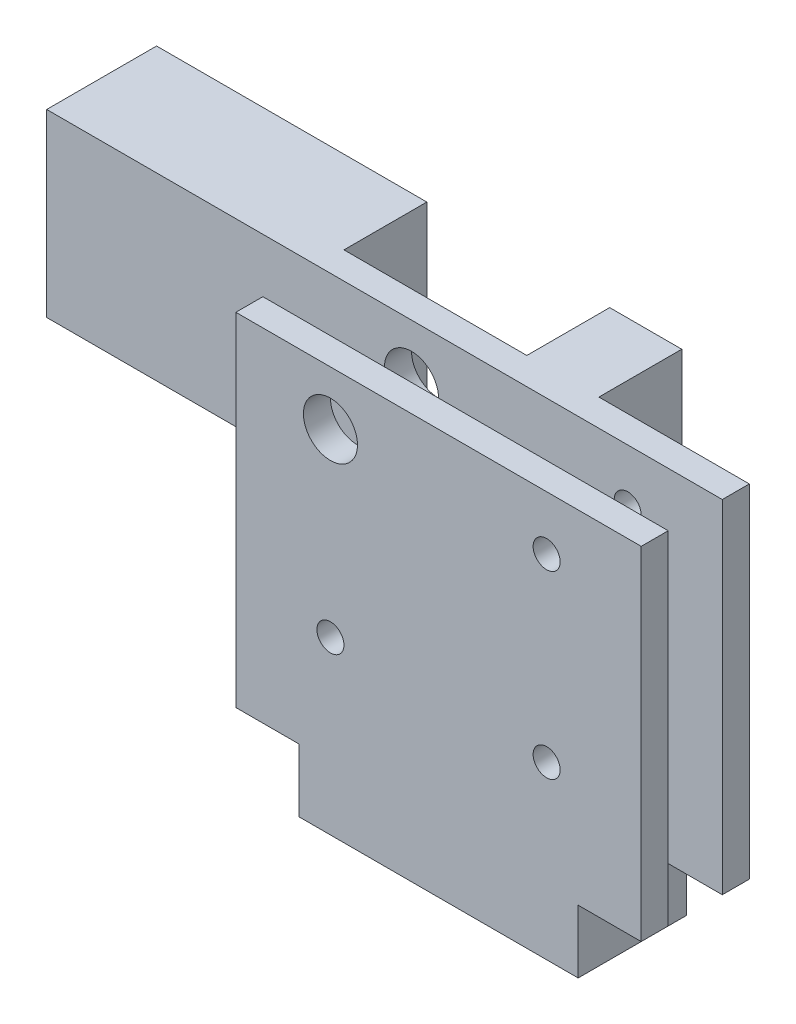
ISO-10303-21;
HEADER;
FILE_DESCRIPTION(('STEP AP214'),'2;1');
FILE_NAME('part.step','',(''),(''),'','','');
FILE_SCHEMA(('AUTOMOTIVE_DESIGN { 1 0 10303 214 1 1 1 1 }'));
ENDSEC;
DATA;
#1=APPLICATION_CONTEXT('core data for automotive mechanical design processes');
#2=APPLICATION_PROTOCOL_DEFINITION('international standard','automotive_design',2000,#1);
#3=PRODUCT_CONTEXT('',#1,'mechanical');
#4=PRODUCT('Part','Part','',(#3));
#5=PRODUCT_RELATED_PRODUCT_CATEGORY('part','',(#4));
#6=PRODUCT_DEFINITION_FORMATION('','',#4);
#7=PRODUCT_DEFINITION_CONTEXT('part definition',#1,'design');
#8=PRODUCT_DEFINITION('design','',#6,#7);
#9=PRODUCT_DEFINITION_SHAPE('','',#8);
#10=(LENGTH_UNIT() NAMED_UNIT(*) SI_UNIT(.MILLI.,.METRE.));
#11=(NAMED_UNIT(*) PLANE_ANGLE_UNIT() SI_UNIT($,.RADIAN.));
#12=(NAMED_UNIT(*) SI_UNIT($,.STERADIAN.) SOLID_ANGLE_UNIT());
#13=UNCERTAINTY_MEASURE_WITH_UNIT(LENGTH_MEASURE(1.E-05),#10,'distance_accuracy_value','');
#14=(GEOMETRIC_REPRESENTATION_CONTEXT(3) GLOBAL_UNCERTAINTY_ASSIGNED_CONTEXT((#13)) GLOBAL_UNIT_ASSIGNED_CONTEXT((#10,
#11,#12)) REPRESENTATION_CONTEXT('',''));
#15=CARTESIAN_POINT('',(0.,0.,0.));
#16=DIRECTION('',(0.,0.,1.));
#17=DIRECTION('',(1.,0.,0.));
#18=AXIS2_PLACEMENT_3D('',#15,#16,#17);
#19=CARTESIAN_POINT('',(0.,0.,0.));
#20=DIRECTION('',(0.,0.,1.));
#21=DIRECTION('',(1.,0.,0.));
#22=AXIS2_PLACEMENT_3D('',#19,#20,#21);
#23=PLANE('',#22);
#24=CARTESIAN_POINT('',(-12.,-3.5,0.));
#25=DIRECTION('',(0.,0.,1.));
#26=DIRECTION('',(1.,0.,0.));
#27=AXIS2_PLACEMENT_3D('',#24,#25,#26);
#28=CIRCLE('',#27,1.5);
#29=CARTESIAN_POINT('',(-10.5,-3.5,0.));
#30=VERTEX_POINT('',#29);
#31=EDGE_CURVE('E293',#30,#30,#28,.T.);
#32=ORIENTED_EDGE('',*,*,#31,.T.);
#33=EDGE_LOOP('',(#32));
#34=FACE_BOUND('',#33,.T.);
#35=CARTESIAN_POINT('',(12.,-3.49999999999999,0.));
#36=DIRECTION('',(0.,0.,1.));
#37=DIRECTION('',(1.,0.,0.));
#38=AXIS2_PLACEMENT_3D('',#35,#36,#37);
#39=CIRCLE('',#38,1.5);
#40=CARTESIAN_POINT('',(13.5,-3.49999999999999,0.));
#41=VERTEX_POINT('',#40);
#42=EDGE_CURVE('E274',#41,#41,#39,.T.);
#43=ORIENTED_EDGE('',*,*,#42,.T.);
#44=EDGE_LOOP('',(#43));
#45=FACE_BOUND('',#44,.T.);
#46=CARTESIAN_POINT('',(-12.,16.5,0.));
#47=DIRECTION('',(0.,0.,1.));
#48=DIRECTION('',(1.,0.,0.));
#49=AXIS2_PLACEMENT_3D('',#46,#47,#48);
#50=CIRCLE('',#49,3.);
#51=CARTESIAN_POINT('',(-9.,16.5,0.));
#52=VERTEX_POINT('',#51);
#53=EDGE_CURVE('E313',#52,#52,#50,.T.);
#54=ORIENTED_EDGE('',*,*,#53,.T.);
#55=EDGE_LOOP('',(#54));
#56=FACE_BOUND('',#55,.T.);
#57=CARTESIAN_POINT('',(12.,16.5,0.));
#58=DIRECTION('',(0.,0.,1.));
#59=DIRECTION('',(1.,0.,0.));
#60=AXIS2_PLACEMENT_3D('',#57,#58,#59);
#61=CIRCLE('',#60,1.5);
#62=CARTESIAN_POINT('',(13.5,16.5,0.));
#63=VERTEX_POINT('',#62);
#64=EDGE_CURVE('E312',#63,#63,#61,.T.);
#65=ORIENTED_EDGE('',*,*,#64,.T.);
#66=EDGE_LOOP('',(#65));
#67=FACE_BOUND('',#66,.T.);
#68=DIRECTION('',(0.,-1.,0.));
#69=VECTOR('',#68,1.);
#70=CARTESIAN_POINT('',(-22.5,22.5,0.));
#71=LINE('',#70,#69);
#72=CARTESIAN_POINT('',(-22.5,22.5,0.));
#73=VERTEX_POINT('',#72);
#74=CARTESIAN_POINT('',(-22.5,2.5,0.));
#75=VERTEX_POINT('',#74);
#76=EDGE_CURVE('E210',#73,#75,#71,.T.);
#77=ORIENTED_EDGE('',*,*,#76,.F.);
#78=DIRECTION('',(-1.,0.,0.));
#79=VECTOR('',#78,1.);
#80=CARTESIAN_POINT('',(22.5,22.5,0.));
#81=LINE('',#80,#79);
#82=CARTESIAN_POINT('',(-2.19999999999999,22.5,0.));
#83=VERTEX_POINT('',#82);
#84=EDGE_CURVE('E64',#83,#73,#81,.T.);
#85=ORIENTED_EDGE('',*,*,#84,.F.);
#86=DIRECTION('',(0.,1.,0.));
#87=VECTOR('',#86,1.);
#88=CARTESIAN_POINT('',(-2.2,22.5,0.));
#89=LINE('',#88,#87);
#90=CARTESIAN_POINT('',(-2.2,2.5,0.));
#91=VERTEX_POINT('',#90);
#92=EDGE_CURVE('E240',#91,#83,#89,.T.);
#93=ORIENTED_EDGE('',*,*,#92,.F.);
#94=DIRECTION('',(-1.,0.,0.));
#95=VECTOR('',#94,1.);
#96=CARTESIAN_POINT('',(5.8,2.5,0.));
#97=LINE('',#96,#95);
#98=CARTESIAN_POINT('',(5.8,2.5,0.));
#99=VERTEX_POINT('',#98);
#100=EDGE_CURVE('E58',#99,#91,#97,.T.);
#101=ORIENTED_EDGE('',*,*,#100,.F.);
#102=DIRECTION('',(0.,-1.,0.));
#103=VECTOR('',#102,1.);
#104=CARTESIAN_POINT('',(5.8,22.5,0.));
#105=LINE('',#104,#103);
#106=CARTESIAN_POINT('',(5.80000000000001,22.5,0.));
#107=VERTEX_POINT('',#106);
#108=EDGE_CURVE('E244',#107,#99,#105,.T.);
#109=ORIENTED_EDGE('',*,*,#108,.F.);
#110=CARTESIAN_POINT('',(22.5,22.5,0.));
#111=VERTEX_POINT('',#110);
#112=EDGE_CURVE('E362',#111,#107,#81,.T.);
#113=ORIENTED_EDGE('',*,*,#112,.F.);
#114=DIRECTION('',(0.,1.,0.));
#115=VECTOR('',#114,1.);
#116=CARTESIAN_POINT('',(22.5,-22.5,0.));
#117=LINE('',#116,#115);
#118=CARTESIAN_POINT('',(22.5,-15.5,0.));
#119=VERTEX_POINT('',#118);
#120=EDGE_CURVE('E374',#119,#111,#117,.T.);
#121=ORIENTED_EDGE('',*,*,#120,.F.);
#122=DIRECTION('',(1.,0.,0.));
#123=VECTOR('',#122,1.);
#124=CARTESIAN_POINT('',(22.5,-15.5,0.));
#125=LINE('',#124,#123);
#126=CARTESIAN_POINT('',(15.5,-15.5,0.));
#127=VERTEX_POINT('',#126);
#128=EDGE_CURVE('E278',#127,#119,#125,.T.);
#129=ORIENTED_EDGE('',*,*,#128,.F.);
#130=DIRECTION('',(0.,-1.,0.));
#131=VECTOR('',#130,1.);
#132=CARTESIAN_POINT('',(15.5,-15.5,0.));
#133=LINE('',#132,#131);
#134=CARTESIAN_POINT('',(15.5,-22.5,0.));
#135=VERTEX_POINT('',#134);
#136=EDGE_CURVE('E247',#127,#135,#133,.T.);
#137=ORIENTED_EDGE('',*,*,#136,.T.);
#138=DIRECTION('',(1.,0.,0.));
#139=VECTOR('',#138,1.);
#140=CARTESIAN_POINT('',(22.5,-22.5,0.));
#141=LINE('',#140,#139);
#142=CARTESIAN_POINT('',(-15.5,-22.5,0.));
#143=VERTEX_POINT('',#142);
#144=EDGE_CURVE('E371',#143,#135,#141,.T.);
#145=ORIENTED_EDGE('',*,*,#144,.F.);
#146=DIRECTION('',(0.,-1.,0.));
#147=VECTOR('',#146,1.);
#148=CARTESIAN_POINT('',(-15.5,-15.5,0.));
#149=LINE('',#148,#147);
#150=CARTESIAN_POINT('',(-15.5,-15.5,0.));
#151=VERTEX_POINT('',#150);
#152=EDGE_CURVE('E267',#151,#143,#149,.T.);
#153=ORIENTED_EDGE('',*,*,#152,.F.);
#154=DIRECTION('',(1.,0.,0.));
#155=VECTOR('',#154,1.);
#156=CARTESIAN_POINT('',(-22.5,-15.5,0.));
#157=LINE('',#156,#155);
#158=CARTESIAN_POINT('',(-22.5,-15.5,0.));
#159=VERTEX_POINT('',#158);
#160=EDGE_CURVE('E257',#159,#151,#157,.T.);
#161=ORIENTED_EDGE('',*,*,#160,.F.);
#162=DIRECTION('',(0.,-1.,0.));
#163=VECTOR('',#162,1.);
#164=CARTESIAN_POINT('',(-22.5,-22.5,0.));
#165=LINE('',#164,#163);
#166=EDGE_CURVE('E345',#75,#159,#165,.T.);
#167=ORIENTED_EDGE('',*,*,#166,.F.);
#168=EDGE_LOOP('',(#77,#85,#93,#101,#109,#113,#121,#129,#137,#145,#153,#161,#167));
#169=FACE_BOUND('',#168,.T.);
#170=ADVANCED_FACE('F43',(#34,#45,#56,#67,#169),#23,.F.);
#171=CARTESIAN_POINT('',(-22.5,-22.5,12.));
#172=DIRECTION('',(1.,0.,0.));
#173=DIRECTION('',(0.,0.,-1.));
#174=AXIS2_PLACEMENT_3D('',#171,#172,#173);
#175=PLANE('',#174);
#176=DIRECTION('',(0.,0.,-1.));
#177=VECTOR('',#176,1.);
#178=CARTESIAN_POINT('',(-22.5,-15.5,12.));
#179=LINE('',#178,#177);
#180=CARTESIAN_POINT('',(-22.5,-15.5,12.));
#181=VERTEX_POINT('',#180);
#182=CARTESIAN_POINT('',(-22.5,-15.5,9.));
#183=VERTEX_POINT('',#182);
#184=EDGE_CURVE('E255',#181,#183,#179,.T.);
#185=ORIENTED_EDGE('',*,*,#184,.F.);
#186=DIRECTION('',(0.,-1.,0.));
#187=VECTOR('',#186,1.);
#188=CARTESIAN_POINT('',(-22.5,-22.5,12.));
#189=LINE('',#188,#187);
#190=CARTESIAN_POINT('',(-22.5,22.5,12.));
#191=VERTEX_POINT('',#190);
#192=EDGE_CURVE('E358',#191,#181,#189,.T.);
#193=ORIENTED_EDGE('',*,*,#192,.F.);
#194=DIRECTION('',(0.,0.,-1.));
#195=VECTOR('',#194,1.);
#196=CARTESIAN_POINT('',(-22.5,22.5,12.));
#197=LINE('',#196,#195);
#198=CARTESIAN_POINT('',(-22.5,22.5,9.));
#199=VERTEX_POINT('',#198);
#200=EDGE_CURVE('E369',#191,#199,#197,.T.);
#201=ORIENTED_EDGE('',*,*,#200,.T.);
#202=DIRECTION('',(0.,1.,0.));
#203=VECTOR('',#202,1.);
#204=CARTESIAN_POINT('',(-22.5,-15.5,9.));
#205=LINE('',#204,#203);
#206=EDGE_CURVE('E337',#183,#199,#205,.T.);
#207=ORIENTED_EDGE('',*,*,#206,.F.);
#208=EDGE_LOOP('',(#185,#193,#201,#207));
#209=FACE_BOUND('',#208,.T.);
#210=ADVANCED_FACE('F45',(#209),#175,.F.);
#211=DIRECTION('',(0.,-1.,0.));
#212=VECTOR('',#211,1.);
#213=CARTESIAN_POINT('',(-22.5,-15.5,3.));
#214=LINE('',#213,#212);
#215=CARTESIAN_POINT('',(-22.5,2.5,3.));
#216=VERTEX_POINT('',#215);
#217=CARTESIAN_POINT('',(-22.5,-15.5,3.));
#218=VERTEX_POINT('',#217);
#219=EDGE_CURVE('E332',#216,#218,#214,.T.);
#220=ORIENTED_EDGE('',*,*,#219,.F.);
#221=DIRECTION('',(0.,0.,-1.));
#222=VECTOR('',#221,1.);
#223=CARTESIAN_POINT('',(-22.5,2.5,3.));
#224=LINE('',#223,#222);
#225=EDGE_CURVE('E226',#216,#75,#224,.T.);
#226=ORIENTED_EDGE('',*,*,#225,.T.);
#227=ORIENTED_EDGE('',*,*,#166,.T.);
#228=EDGE_CURVE('E258',#218,#159,#179,.T.);
#229=ORIENTED_EDGE('',*,*,#228,.F.);
#230=EDGE_LOOP('',(#220,#226,#227,#229));
#231=FACE_BOUND('',#230,.T.);
#232=ADVANCED_FACE('F411',(#231),#175,.F.);
#233=CARTESIAN_POINT('',(22.5,-22.5,12.));
#234=DIRECTION('',(-1.,0.,0.));
#235=DIRECTION('',(0.,0.,1.));
#236=AXIS2_PLACEMENT_3D('',#233,#234,#235);
#237=PLANE('',#236);
#238=DIRECTION('',(0.,0.,1.));
#239=VECTOR('',#238,1.);
#240=CARTESIAN_POINT('',(22.5,-15.5,0.));
#241=LINE('',#240,#239);
#242=CARTESIAN_POINT('',(22.5,-15.5,3.));
#243=VERTEX_POINT('',#242);
#244=EDGE_CURVE('E282',#119,#243,#241,.T.);
#245=ORIENTED_EDGE('',*,*,#244,.F.);
#246=ORIENTED_EDGE('',*,*,#120,.T.);
#247=DIRECTION('',(0.,0.,-1.));
#248=VECTOR('',#247,1.);
#249=CARTESIAN_POINT('',(22.5,22.5,12.));
#250=LINE('',#249,#248);
#251=CARTESIAN_POINT('',(22.5,22.5,3.));
#252=VERTEX_POINT('',#251);
#253=EDGE_CURVE('E380',#252,#111,#250,.T.);
#254=ORIENTED_EDGE('',*,*,#253,.F.);
#255=DIRECTION('',(0.,-1.,0.));
#256=VECTOR('',#255,1.);
#257=CARTESIAN_POINT('',(22.5,-15.5,3.));
#258=LINE('',#257,#256);
#259=EDGE_CURVE('E333',#252,#243,#258,.T.);
#260=ORIENTED_EDGE('',*,*,#259,.T.);
#261=EDGE_LOOP('',(#245,#246,#254,#260));
#262=FACE_BOUND('',#261,.T.);
#263=ADVANCED_FACE('F456',(#262),#237,.F.);
#264=CARTESIAN_POINT('',(22.5,-15.5,9.));
#265=VERTEX_POINT('',#264);
#266=CARTESIAN_POINT('',(22.5,-15.5,12.));
#267=VERTEX_POINT('',#266);
#268=EDGE_CURVE('E291',#265,#267,#241,.T.);
#269=ORIENTED_EDGE('',*,*,#268,.F.);
#270=DIRECTION('',(0.,1.,0.));
#271=VECTOR('',#270,1.);
#272=CARTESIAN_POINT('',(22.5,-15.5,9.));
#273=LINE('',#272,#271);
#274=CARTESIAN_POINT('',(22.5,22.5,9.));
#275=VERTEX_POINT('',#274);
#276=EDGE_CURVE('E336',#265,#275,#273,.T.);
#277=ORIENTED_EDGE('',*,*,#276,.T.);
#278=CARTESIAN_POINT('',(22.5,22.5,12.));
#279=VERTEX_POINT('',#278);
#280=EDGE_CURVE('E381',#279,#275,#250,.T.);
#281=ORIENTED_EDGE('',*,*,#280,.F.);
#282=DIRECTION('',(0.,1.,0.));
#283=VECTOR('',#282,1.);
#284=CARTESIAN_POINT('',(22.5,-22.5,12.));
#285=LINE('',#284,#283);
#286=EDGE_CURVE('E365',#267,#279,#285,.T.);
#287=ORIENTED_EDGE('',*,*,#286,.F.);
#288=EDGE_LOOP('',(#269,#277,#281,#287));
#289=FACE_BOUND('',#288,.T.);
#290=ADVANCED_FACE('F443',(#289),#237,.F.);
#291=CARTESIAN_POINT('',(22.5,22.5,12.));
#292=DIRECTION('',(0.,-1.,0.));
#293=DIRECTION('',(1.,0.,0.));
#294=AXIS2_PLACEMENT_3D('',#291,#292,#293);
#295=PLANE('',#294);
#296=ORIENTED_EDGE('',*,*,#84,.T.);
#297=DIRECTION('',(0.,0.,1.));
#298=VECTOR('',#297,1.);
#299=CARTESIAN_POINT('',(-22.5,22.5,-9.2));
#300=LINE('',#299,#298);
#301=CARTESIAN_POINT('',(-22.5,22.5,-9.2));
#302=VERTEX_POINT('',#301);
#303=EDGE_CURVE('E215',#302,#73,#300,.T.);
#304=ORIENTED_EDGE('',*,*,#303,.F.);
#305=DIRECTION('',(1.,0.,0.));
#306=VECTOR('',#305,1.);
#307=CARTESIAN_POINT('',(-22.5,22.5,-9.2));
#308=LINE('',#307,#306);
#309=CARTESIAN_POINT('',(-52.5,22.5,-9.2));
#310=VERTEX_POINT('',#309);
#311=EDGE_CURVE('E207',#310,#302,#308,.T.);
#312=ORIENTED_EDGE('',*,*,#311,.F.);
#313=DIRECTION('',(0.,0.,-1.));
#314=VECTOR('',#313,1.);
#315=CARTESIAN_POINT('',(-52.5,22.5,3.));
#316=LINE('',#315,#314);
#317=CARTESIAN_POINT('',(-52.5,22.5,3.));
#318=VERTEX_POINT('',#317);
#319=EDGE_CURVE('E224',#318,#310,#316,.T.);
#320=ORIENTED_EDGE('',*,*,#319,.F.);
#321=DIRECTION('',(-1.,0.,0.));
#322=VECTOR('',#321,1.);
#323=CARTESIAN_POINT('',(22.5,22.5,3.));
#324=LINE('',#323,#322);
#325=EDGE_CURVE('E343',#252,#318,#324,.T.);
#326=ORIENTED_EDGE('',*,*,#325,.F.);
#327=ORIENTED_EDGE('',*,*,#253,.T.);
#328=ORIENTED_EDGE('',*,*,#112,.T.);
#329=DIRECTION('',(0.,0.,1.));
#330=VECTOR('',#329,1.);
#331=CARTESIAN_POINT('',(5.8,22.5,-9.2));
#332=LINE('',#331,#330);
#333=CARTESIAN_POINT('',(5.8,22.5,-9.2));
#334=VERTEX_POINT('',#333);
#335=EDGE_CURVE('E236',#334,#107,#332,.T.);
#336=ORIENTED_EDGE('',*,*,#335,.F.);
#337=DIRECTION('',(1.,0.,0.));
#338=VECTOR('',#337,1.);
#339=CARTESIAN_POINT('',(5.8,22.5,-9.2));
#340=LINE('',#339,#338);
#341=CARTESIAN_POINT('',(-2.2,22.5,-9.2));
#342=VERTEX_POINT('',#341);
#343=EDGE_CURVE('E239',#342,#334,#340,.T.);
#344=ORIENTED_EDGE('',*,*,#343,.F.);
#345=DIRECTION('',(0.,0.,1.));
#346=VECTOR('',#345,1.);
#347=CARTESIAN_POINT('',(-2.2,22.5,-9.2));
#348=LINE('',#347,#346);
#349=EDGE_CURVE('E233',#342,#83,#348,.T.);
#350=ORIENTED_EDGE('',*,*,#349,.T.);
#351=EDGE_LOOP('',(#296,#304,#312,#320,#326,#327,#328,#336,#344,#350));
#352=FACE_BOUND('',#351,.T.);
#353=ADVANCED_FACE('F470',(#352),#295,.F.);
#354=CARTESIAN_POINT('',(22.5,-22.5,12.));
#355=DIRECTION('',(0.,1.,0.));
#356=DIRECTION('',(-1.,0.,0.));
#357=AXIS2_PLACEMENT_3D('',#354,#355,#356);
#358=PLANE('',#357);
#359=DIRECTION('',(1.,0.,0.));
#360=VECTOR('',#359,1.);
#361=CARTESIAN_POINT('',(22.5,-22.5,12.));
#362=LINE('',#361,#360);
#363=CARTESIAN_POINT('',(-15.5,-22.5,12.));
#364=VERTEX_POINT('',#363);
#365=CARTESIAN_POINT('',(15.5,-22.5,12.));
#366=VERTEX_POINT('',#365);
#367=EDGE_CURVE('E361',#364,#366,#362,.T.);
#368=ORIENTED_EDGE('',*,*,#367,.F.);
#369=DIRECTION('',(0.,0.,1.));
#370=VECTOR('',#369,1.);
#371=CARTESIAN_POINT('',(-15.5,-22.5,12.));
#372=LINE('',#371,#370);
#373=EDGE_CURVE('E268',#143,#364,#372,.T.);
#374=ORIENTED_EDGE('',*,*,#373,.F.);
#375=ORIENTED_EDGE('',*,*,#144,.T.);
#376=DIRECTION('',(0.,0.,-1.));
#377=VECTOR('',#376,1.);
#378=CARTESIAN_POINT('',(15.5,-22.5,0.));
#379=LINE('',#378,#377);
#380=EDGE_CURVE('E270',#366,#135,#379,.T.);
#381=ORIENTED_EDGE('',*,*,#380,.F.);
#382=EDGE_LOOP('',(#368,#374,#375,#381));
#383=FACE_BOUND('',#382,.T.);
#384=ADVANCED_FACE('F421',(#383),#358,.F.);
#385=ORIENTED_EDGE('',*,*,#280,.T.);
#386=DIRECTION('',(-1.,0.,0.));
#387=VECTOR('',#386,1.);
#388=CARTESIAN_POINT('',(22.5,22.5,9.));
#389=LINE('',#388,#387);
#390=EDGE_CURVE('E346',#275,#199,#389,.T.);
#391=ORIENTED_EDGE('',*,*,#390,.T.);
#392=ORIENTED_EDGE('',*,*,#200,.F.);
#393=DIRECTION('',(-1.,0.,0.));
#394=VECTOR('',#393,1.);
#395=CARTESIAN_POINT('',(22.5,22.5,12.));
#396=LINE('',#395,#394);
#397=EDGE_CURVE('E367',#279,#191,#396,.T.);
#398=ORIENTED_EDGE('',*,*,#397,.F.);
#399=EDGE_LOOP('',(#385,#391,#392,#398));
#400=FACE_BOUND('',#399,.T.);
#401=ADVANCED_FACE('F449',(#400),#295,.F.);
#402=CARTESIAN_POINT('',(0.,0.,12.));
#403=DIRECTION('',(0.,0.,1.));
#404=DIRECTION('',(1.,0.,0.));
#405=AXIS2_PLACEMENT_3D('',#402,#403,#404);
#406=PLANE('',#405);
#407=DIRECTION('',(0.,-1.,0.));
#408=VECTOR('',#407,1.);
#409=CARTESIAN_POINT('',(-15.5,-15.5,12.));
#410=LINE('',#409,#408);
#411=CARTESIAN_POINT('',(-15.5,-15.5,12.));
#412=VERTEX_POINT('',#411);
#413=EDGE_CURVE('E271',#412,#364,#410,.T.);
#414=ORIENTED_EDGE('',*,*,#413,.T.);
#415=ORIENTED_EDGE('',*,*,#367,.T.);
#416=DIRECTION('',(0.,-1.,0.));
#417=VECTOR('',#416,1.);
#418=CARTESIAN_POINT('',(15.5,-15.5,12.));
#419=LINE('',#418,#417);
#420=CARTESIAN_POINT('',(15.5,-15.5,12.));
#421=VERTEX_POINT('',#420);
#422=EDGE_CURVE('E276',#421,#366,#419,.T.);
#423=ORIENTED_EDGE('',*,*,#422,.F.);
#424=DIRECTION('',(-1.,0.,0.));
#425=VECTOR('',#424,1.);
#426=CARTESIAN_POINT('',(22.5,-15.5,12.));
#427=LINE('',#426,#425);
#428=EDGE_CURVE('E288',#267,#421,#427,.T.);
#429=ORIENTED_EDGE('',*,*,#428,.F.);
#430=ORIENTED_EDGE('',*,*,#286,.T.);
#431=ORIENTED_EDGE('',*,*,#397,.T.);
#432=ORIENTED_EDGE('',*,*,#192,.T.);
#433=DIRECTION('',(-1.,0.,0.));
#434=VECTOR('',#433,1.);
#435=CARTESIAN_POINT('',(-22.5,-15.5,12.));
#436=LINE('',#435,#434);
#437=EDGE_CURVE('E265',#412,#181,#436,.T.);
#438=ORIENTED_EDGE('',*,*,#437,.F.);
#439=EDGE_LOOP('',(#414,#415,#423,#429,#430,#431,#432,#438));
#440=FACE_BOUND('',#439,.T.);
#441=CARTESIAN_POINT('',(-12.,-3.5,12.));
#442=DIRECTION('',(0.,0.,1.));
#443=DIRECTION('',(1.,0.,0.));
#444=AXIS2_PLACEMENT_3D('',#441,#442,#443);
#445=CIRCLE('',#444,1.5);
#446=CARTESIAN_POINT('',(-10.5,-3.5,12.));
#447=VERTEX_POINT('',#446);
#448=EDGE_CURVE('E297',#447,#447,#445,.T.);
#449=ORIENTED_EDGE('',*,*,#448,.F.);
#450=EDGE_LOOP('',(#449));
#451=FACE_BOUND('',#450,.T.);
#452=CARTESIAN_POINT('',(12.,-3.49999999999999,12.));
#453=DIRECTION('',(0.,0.,1.));
#454=DIRECTION('',(1.,0.,0.));
#455=AXIS2_PLACEMENT_3D('',#452,#453,#454);
#456=CIRCLE('',#455,1.5);
#457=CARTESIAN_POINT('',(13.5,-3.49999999999999,12.));
#458=VERTEX_POINT('',#457);
#459=EDGE_CURVE('E300',#458,#458,#456,.T.);
#460=ORIENTED_EDGE('',*,*,#459,.F.);
#461=EDGE_LOOP('',(#460));
#462=FACE_BOUND('',#461,.T.);
#463=CARTESIAN_POINT('',(-12.,16.5,12.));
#464=DIRECTION('',(0.,0.,1.));
#465=DIRECTION('',(1.,0.,0.));
#466=AXIS2_PLACEMENT_3D('',#463,#464,#465);
#467=CIRCLE('',#466,3.);
#468=CARTESIAN_POINT('',(-9.,16.5,12.));
#469=VERTEX_POINT('',#468);
#470=EDGE_CURVE('E317',#469,#469,#467,.T.);
#471=ORIENTED_EDGE('',*,*,#470,.F.);
#472=EDGE_LOOP('',(#471));
#473=FACE_BOUND('',#472,.T.);
#474=CARTESIAN_POINT('',(12.,16.5,12.));
#475=DIRECTION('',(0.,0.,1.));
#476=DIRECTION('',(1.,0.,0.));
#477=AXIS2_PLACEMENT_3D('',#474,#475,#476);
#478=CIRCLE('',#477,1.5);
#479=CARTESIAN_POINT('',(13.5,16.5,12.));
#480=VERTEX_POINT('',#479);
#481=EDGE_CURVE('E320',#480,#480,#478,.T.);
#482=ORIENTED_EDGE('',*,*,#481,.F.);
#483=EDGE_LOOP('',(#482));
#484=FACE_BOUND('',#483,.T.);
#485=ADVANCED_FACE('F425',(#440,#451,#462,#473,#484),#406,.T.);
#486=CARTESIAN_POINT('',(22.5,-15.5,3.));
#487=DIRECTION('',(0.,0.,-1.));
#488=DIRECTION('',(-1.,0.,0.));
#489=AXIS2_PLACEMENT_3D('',#486,#487,#488);
#490=PLANE('',#489);
#491=CARTESIAN_POINT('',(-12.,-3.5,3.));
#492=DIRECTION('',(0.,0.,-1.));
#493=DIRECTION('',(-1.,0.,0.));
#494=AXIS2_PLACEMENT_3D('',#491,#492,#493);
#495=CIRCLE('',#494,1.5);
#496=CARTESIAN_POINT('',(-13.5,-3.5,3.));
#497=VERTEX_POINT('',#496);
#498=EDGE_CURVE('E309',#497,#497,#495,.T.);
#499=ORIENTED_EDGE('',*,*,#498,.T.);
#500=EDGE_LOOP('',(#499));
#501=FACE_BOUND('',#500,.T.);
#502=CARTESIAN_POINT('',(12.,-3.49999999999999,3.));
#503=DIRECTION('',(0.,0.,-1.));
#504=DIRECTION('',(-1.,0.,0.));
#505=AXIS2_PLACEMENT_3D('',#502,#503,#504);
#506=CIRCLE('',#505,1.5);
#507=CARTESIAN_POINT('',(10.5,-3.49999999999999,3.));
#508=VERTEX_POINT('',#507);
#509=EDGE_CURVE('E305',#508,#508,#506,.T.);
#510=ORIENTED_EDGE('',*,*,#509,.T.);
#511=EDGE_LOOP('',(#510));
#512=FACE_BOUND('',#511,.T.);
#513=CARTESIAN_POINT('',(-12.,16.5,3.));
#514=DIRECTION('',(0.,0.,-1.));
#515=DIRECTION('',(-1.,0.,0.));
#516=AXIS2_PLACEMENT_3D('',#513,#514,#515);
#517=CIRCLE('',#516,3.);
#518=CARTESIAN_POINT('',(-15.,16.5,3.));
#519=VERTEX_POINT('',#518);
#520=EDGE_CURVE('E329',#519,#519,#517,.T.);
#521=ORIENTED_EDGE('',*,*,#520,.T.);
#522=EDGE_LOOP('',(#521));
#523=FACE_BOUND('',#522,.T.);
#524=CARTESIAN_POINT('',(12.,16.5,3.));
#525=DIRECTION('',(0.,0.,-1.));
#526=DIRECTION('',(-1.,0.,0.));
#527=AXIS2_PLACEMENT_3D('',#524,#525,#526);
#528=CIRCLE('',#527,1.5);
#529=CARTESIAN_POINT('',(10.5,16.5,3.));
#530=VERTEX_POINT('',#529);
#531=EDGE_CURVE('E325',#530,#530,#528,.T.);
#532=ORIENTED_EDGE('',*,*,#531,.T.);
#533=EDGE_LOOP('',(#532));
#534=FACE_BOUND('',#533,.T.);
#535=ORIENTED_EDGE('',*,*,#325,.T.);
#536=DIRECTION('',(0.,-1.,0.));
#537=VECTOR('',#536,1.);
#538=CARTESIAN_POINT('',(-52.5,22.5,3.));
#539=LINE('',#538,#537);
#540=CARTESIAN_POINT('',(-52.5,2.5,3.));
#541=VERTEX_POINT('',#540);
#542=EDGE_CURVE('E217',#318,#541,#539,.T.);
#543=ORIENTED_EDGE('',*,*,#542,.T.);
#544=DIRECTION('',(1.,0.,0.));
#545=VECTOR('',#544,1.);
#546=CARTESIAN_POINT('',(-52.5,2.5,3.));
#547=LINE('',#546,#545);
#548=EDGE_CURVE('E214',#541,#216,#547,.T.);
#549=ORIENTED_EDGE('',*,*,#548,.T.);
#550=ORIENTED_EDGE('',*,*,#219,.T.);
#551=DIRECTION('',(-1.,0.,0.));
#552=VECTOR('',#551,1.);
#553=CARTESIAN_POINT('',(22.5,-15.5,3.));
#554=LINE('',#553,#552);
#555=CARTESIAN_POINT('',(-15.5,-15.5,3.));
#556=VERTEX_POINT('',#555);
#557=EDGE_CURVE('E340',#556,#218,#554,.T.);
#558=ORIENTED_EDGE('',*,*,#557,.F.);
#559=CARTESIAN_POINT('',(15.5,-15.5,3.));
#560=VERTEX_POINT('',#559);
#561=EDGE_CURVE('E357',#560,#556,#554,.T.);
#562=ORIENTED_EDGE('',*,*,#561,.F.);
#563=EDGE_CURVE('E354',#243,#560,#554,.T.);
#564=ORIENTED_EDGE('',*,*,#563,.F.);
#565=ORIENTED_EDGE('',*,*,#259,.F.);
#566=EDGE_LOOP('',(#535,#543,#549,#550,#558,#562,#564,#565));
#567=FACE_BOUND('',#566,.T.);
#568=ADVANCED_FACE('F402',(#501,#512,#523,#534,#567),#490,.F.);
#569=CARTESIAN_POINT('',(22.5,-15.5,9.));
#570=DIRECTION('',(0.,0.,1.));
#571=DIRECTION('',(1.,0.,0.));
#572=AXIS2_PLACEMENT_3D('',#569,#570,#571);
#573=PLANE('',#572);
#574=CARTESIAN_POINT('',(-12.,-3.5,9.));
#575=DIRECTION('',(0.,0.,1.));
#576=DIRECTION('',(1.,0.,0.));
#577=AXIS2_PLACEMENT_3D('',#574,#575,#576);
#578=CIRCLE('',#577,1.5);
#579=CARTESIAN_POINT('',(-10.5,-3.5,9.));
#580=VERTEX_POINT('',#579);
#581=EDGE_CURVE('E308',#580,#580,#578,.T.);
#582=ORIENTED_EDGE('',*,*,#581,.T.);
#583=EDGE_LOOP('',(#582));
#584=FACE_BOUND('',#583,.T.);
#585=CARTESIAN_POINT('',(12.,-3.49999999999999,9.));
#586=DIRECTION('',(0.,0.,1.));
#587=DIRECTION('',(1.,0.,0.));
#588=AXIS2_PLACEMENT_3D('',#585,#586,#587);
#589=CIRCLE('',#588,1.5);
#590=CARTESIAN_POINT('',(13.5,-3.49999999999999,9.));
#591=VERTEX_POINT('',#590);
#592=EDGE_CURVE('E296',#591,#591,#589,.T.);
#593=ORIENTED_EDGE('',*,*,#592,.T.);
#594=EDGE_LOOP('',(#593));
#595=FACE_BOUND('',#594,.T.);
#596=CARTESIAN_POINT('',(-12.,16.5,9.));
#597=DIRECTION('',(0.,0.,1.));
#598=DIRECTION('',(1.,0.,0.));
#599=AXIS2_PLACEMENT_3D('',#596,#597,#598);
#600=CIRCLE('',#599,3.);
#601=CARTESIAN_POINT('',(-9.,16.5,9.));
#602=VERTEX_POINT('',#601);
#603=EDGE_CURVE('E328',#602,#602,#600,.T.);
#604=ORIENTED_EDGE('',*,*,#603,.T.);
#605=EDGE_LOOP('',(#604));
#606=FACE_BOUND('',#605,.T.);
#607=CARTESIAN_POINT('',(12.,16.5,9.));
#608=DIRECTION('',(0.,0.,1.));
#609=DIRECTION('',(1.,0.,0.));
#610=AXIS2_PLACEMENT_3D('',#607,#608,#609);
#611=CIRCLE('',#610,1.5);
#612=CARTESIAN_POINT('',(13.5,16.5,9.));
#613=VERTEX_POINT('',#612);
#614=EDGE_CURVE('E316',#613,#613,#611,.T.);
#615=ORIENTED_EDGE('',*,*,#614,.T.);
#616=EDGE_LOOP('',(#615));
#617=FACE_BOUND('',#616,.T.);
#618=ORIENTED_EDGE('',*,*,#206,.T.);
#619=ORIENTED_EDGE('',*,*,#390,.F.);
#620=ORIENTED_EDGE('',*,*,#276,.F.);
#621=DIRECTION('',(-1.,0.,0.));
#622=VECTOR('',#621,1.);
#623=CARTESIAN_POINT('',(22.5,-15.5,9.));
#624=LINE('',#623,#622);
#625=CARTESIAN_POINT('',(15.5,-15.5,9.));
#626=VERTEX_POINT('',#625);
#627=EDGE_CURVE('E349',#265,#626,#624,.T.);
#628=ORIENTED_EDGE('',*,*,#627,.T.);
#629=CARTESIAN_POINT('',(-15.5,-15.5,9.));
#630=VERTEX_POINT('',#629);
#631=EDGE_CURVE('E352',#626,#630,#624,.T.);
#632=ORIENTED_EDGE('',*,*,#631,.T.);
#633=EDGE_CURVE('E353',#630,#183,#624,.T.);
#634=ORIENTED_EDGE('',*,*,#633,.T.);
#635=EDGE_LOOP('',(#618,#619,#620,#628,#632,#634));
#636=FACE_BOUND('',#635,.T.);
#637=ADVANCED_FACE('F436',(#584,#595,#606,#617,#636),#573,.F.);
#638=CARTESIAN_POINT('',(22.5,-15.5,9.));
#639=DIRECTION('',(0.,-1.,0.));
#640=DIRECTION('',(0.,0.,-1.));
#641=AXIS2_PLACEMENT_3D('',#638,#639,#640);
#642=PLANE('',#641);
#643=ORIENTED_EDGE('',*,*,#561,.T.);
#644=DIRECTION('',(0.,0.,1.));
#645=VECTOR('',#644,1.);
#646=CARTESIAN_POINT('',(-15.5,-15.5,9.));
#647=LINE('',#646,#645);
#648=EDGE_CURVE('E11',#556,#630,#647,.T.);
#649=ORIENTED_EDGE('',*,*,#648,.T.);
#650=ORIENTED_EDGE('',*,*,#631,.F.);
#651=DIRECTION('',(0.,0.,-1.));
#652=VECTOR('',#651,1.);
#653=CARTESIAN_POINT('',(15.5,-15.5,9.));
#654=LINE('',#653,#652);
#655=EDGE_CURVE('E51',#626,#560,#654,.T.);
#656=ORIENTED_EDGE('',*,*,#655,.T.);
#657=EDGE_LOOP('',(#643,#649,#650,#656));
#658=FACE_BOUND('',#657,.T.);
#659=ADVANCED_FACE('F396',(#658),#642,.F.);
#660=CARTESIAN_POINT('',(12.,16.5,0.));
#661=DIRECTION('',(0.,0.,1.));
#662=DIRECTION('',(1.,0.,0.));
#663=AXIS2_PLACEMENT_3D('',#660,#661,#662);
#664=CYLINDRICAL_SURFACE('',#663,1.5);
#665=ORIENTED_EDGE('',*,*,#481,.T.);
#666=EDGE_LOOP('',(#665));
#667=FACE_BOUND('',#666,.T.);
#668=ORIENTED_EDGE('',*,*,#614,.F.);
#669=EDGE_LOOP('',(#668));
#670=FACE_BOUND('',#669,.T.);
#671=ADVANCED_FACE('F536',(#667,#670),#664,.F.);
#672=CARTESIAN_POINT('',(-12.,16.5,0.));
#673=DIRECTION('',(0.,0.,1.));
#674=DIRECTION('',(1.,0.,0.));
#675=AXIS2_PLACEMENT_3D('',#672,#673,#674);
#676=CYLINDRICAL_SURFACE('',#675,3.);
#677=ORIENTED_EDGE('',*,*,#470,.T.);
#678=EDGE_LOOP('',(#677));
#679=FACE_BOUND('',#678,.T.);
#680=ORIENTED_EDGE('',*,*,#603,.F.);
#681=EDGE_LOOP('',(#680));
#682=FACE_BOUND('',#681,.T.);
#683=ADVANCED_FACE('F532',(#679,#682),#676,.F.);
#684=ORIENTED_EDGE('',*,*,#64,.F.);
#685=EDGE_LOOP('',(#684));
#686=FACE_BOUND('',#685,.T.);
#687=ORIENTED_EDGE('',*,*,#531,.F.);
#688=EDGE_LOOP('',(#687));
#689=FACE_BOUND('',#688,.T.);
#690=ADVANCED_FACE('F530',(#686,#689),#664,.F.);
#691=ORIENTED_EDGE('',*,*,#53,.F.);
#692=EDGE_LOOP('',(#691));
#693=FACE_BOUND('',#692,.T.);
#694=ORIENTED_EDGE('',*,*,#520,.F.);
#695=EDGE_LOOP('',(#694));
#696=FACE_BOUND('',#695,.T.);
#697=ADVANCED_FACE('F527',(#693,#696),#676,.F.);
#698=CARTESIAN_POINT('',(12.,-3.49999999999999,0.));
#699=DIRECTION('',(0.,0.,1.));
#700=DIRECTION('',(1.,0.,0.));
#701=AXIS2_PLACEMENT_3D('',#698,#699,#700);
#702=CYLINDRICAL_SURFACE('',#701,1.5);
#703=ORIENTED_EDGE('',*,*,#459,.T.);
#704=EDGE_LOOP('',(#703));
#705=FACE_BOUND('',#704,.T.);
#706=ORIENTED_EDGE('',*,*,#592,.F.);
#707=EDGE_LOOP('',(#706));
#708=FACE_BOUND('',#707,.T.);
#709=ADVANCED_FACE('F526',(#705,#708),#702,.F.);
#710=CARTESIAN_POINT('',(-12.,-3.5,0.));
#711=DIRECTION('',(0.,0.,1.));
#712=DIRECTION('',(1.,0.,0.));
#713=AXIS2_PLACEMENT_3D('',#710,#711,#712);
#714=CYLINDRICAL_SURFACE('',#713,1.5);
#715=ORIENTED_EDGE('',*,*,#448,.T.);
#716=EDGE_LOOP('',(#715));
#717=FACE_BOUND('',#716,.T.);
#718=ORIENTED_EDGE('',*,*,#581,.F.);
#719=EDGE_LOOP('',(#718));
#720=FACE_BOUND('',#719,.T.);
#721=ADVANCED_FACE('F522',(#717,#720),#714,.F.);
#722=ORIENTED_EDGE('',*,*,#42,.F.);
#723=EDGE_LOOP('',(#722));
#724=FACE_BOUND('',#723,.T.);
#725=ORIENTED_EDGE('',*,*,#509,.F.);
#726=EDGE_LOOP('',(#725));
#727=FACE_BOUND('',#726,.T.);
#728=ADVANCED_FACE('F520',(#724,#727),#702,.F.);
#729=ORIENTED_EDGE('',*,*,#31,.F.);
#730=EDGE_LOOP('',(#729));
#731=FACE_BOUND('',#730,.T.);
#732=ORIENTED_EDGE('',*,*,#498,.F.);
#733=EDGE_LOOP('',(#732));
#734=FACE_BOUND('',#733,.T.);
#735=ADVANCED_FACE('F517',(#731,#734),#714,.F.);
#736=CARTESIAN_POINT('',(0.,-15.5,0.));
#737=DIRECTION('',(0.,-1.,0.));
#738=DIRECTION('',(0.,0.,-1.));
#739=AXIS2_PLACEMENT_3D('',#736,#737,#738);
#740=PLANE('',#739);
#741=ORIENTED_EDGE('',*,*,#563,.T.);
#742=DIRECTION('',(0.,0.,-1.));
#743=VECTOR('',#742,1.);
#744=CARTESIAN_POINT('',(15.5,-15.5,0.));
#745=LINE('',#744,#743);
#746=EDGE_CURVE('E284',#560,#127,#745,.T.);
#747=ORIENTED_EDGE('',*,*,#746,.T.);
#748=ORIENTED_EDGE('',*,*,#128,.T.);
#749=ORIENTED_EDGE('',*,*,#244,.T.);
#750=EDGE_LOOP('',(#741,#747,#748,#749));
#751=FACE_BOUND('',#750,.T.);
#752=ADVANCED_FACE('F504',(#751),#740,.T.);
#753=ORIENTED_EDGE('',*,*,#627,.F.);
#754=ORIENTED_EDGE('',*,*,#268,.T.);
#755=ORIENTED_EDGE('',*,*,#428,.T.);
#756=EDGE_CURVE('E285',#421,#626,#745,.T.);
#757=ORIENTED_EDGE('',*,*,#756,.T.);
#758=EDGE_LOOP('',(#753,#754,#755,#757));
#759=FACE_BOUND('',#758,.T.);
#760=ADVANCED_FACE('F440',(#759),#740,.T.);
#761=CARTESIAN_POINT('',(15.5,-15.5,0.));
#762=DIRECTION('',(-1.,0.,0.));
#763=DIRECTION('',(0.,-1.,0.));
#764=AXIS2_PLACEMENT_3D('',#761,#762,#763);
#765=PLANE('',#764);
#766=ORIENTED_EDGE('',*,*,#380,.T.);
#767=ORIENTED_EDGE('',*,*,#136,.F.);
#768=ORIENTED_EDGE('',*,*,#746,.F.);
#769=ORIENTED_EDGE('',*,*,#655,.F.);
#770=ORIENTED_EDGE('',*,*,#756,.F.);
#771=ORIENTED_EDGE('',*,*,#422,.T.);
#772=EDGE_LOOP('',(#766,#767,#768,#769,#770,#771));
#773=FACE_BOUND('',#772,.T.);
#774=ADVANCED_FACE('F505',(#773),#765,.F.);
#775=CARTESIAN_POINT('',(0.,-15.5,0.));
#776=DIRECTION('',(0.,-1.,0.));
#777=DIRECTION('',(0.,0.,-1.));
#778=AXIS2_PLACEMENT_3D('',#775,#776,#777);
#779=PLANE('',#778);
#780=ORIENTED_EDGE('',*,*,#557,.T.);
#781=ORIENTED_EDGE('',*,*,#228,.T.);
#782=ORIENTED_EDGE('',*,*,#160,.T.);
#783=DIRECTION('',(0.,0.,1.));
#784=VECTOR('',#783,1.);
#785=CARTESIAN_POINT('',(-15.5,-15.5,12.));
#786=LINE('',#785,#784);
#787=EDGE_CURVE('E262',#151,#556,#786,.T.);
#788=ORIENTED_EDGE('',*,*,#787,.T.);
#789=EDGE_LOOP('',(#780,#781,#782,#788));
#790=FACE_BOUND('',#789,.T.);
#791=ADVANCED_FACE('F407',(#790),#779,.T.);
#792=ORIENTED_EDGE('',*,*,#633,.F.);
#793=EDGE_CURVE('E261',#630,#412,#786,.T.);
#794=ORIENTED_EDGE('',*,*,#793,.T.);
#795=ORIENTED_EDGE('',*,*,#437,.T.);
#796=ORIENTED_EDGE('',*,*,#184,.T.);
#797=EDGE_LOOP('',(#792,#794,#795,#796));
#798=FACE_BOUND('',#797,.T.);
#799=ADVANCED_FACE('F432',(#798),#779,.T.);
#800=CARTESIAN_POINT('',(-15.5,-15.5,12.));
#801=DIRECTION('',(1.,0.,0.));
#802=DIRECTION('',(0.,1.,0.));
#803=AXIS2_PLACEMENT_3D('',#800,#801,#802);
#804=PLANE('',#803);
#805=ORIENTED_EDGE('',*,*,#373,.T.);
#806=ORIENTED_EDGE('',*,*,#413,.F.);
#807=ORIENTED_EDGE('',*,*,#793,.F.);
#808=ORIENTED_EDGE('',*,*,#648,.F.);
#809=ORIENTED_EDGE('',*,*,#787,.F.);
#810=ORIENTED_EDGE('',*,*,#152,.T.);
#811=EDGE_LOOP('',(#805,#806,#807,#808,#809,#810));
#812=FACE_BOUND('',#811,.T.);
#813=ADVANCED_FACE('F417',(#812),#804,.F.);
#814=CARTESIAN_POINT('',(5.8,22.5,-9.2));
#815=DIRECTION('',(-1.,0.,0.));
#816=DIRECTION('',(0.,-1.,0.));
#817=AXIS2_PLACEMENT_3D('',#814,#815,#816);
#818=PLANE('',#817);
#819=ORIENTED_EDGE('',*,*,#108,.T.);
#820=DIRECTION('',(0.,0.,1.));
#821=VECTOR('',#820,1.);
#822=CARTESIAN_POINT('',(5.8,2.5,-9.2));
#823=LINE('',#822,#821);
#824=CARTESIAN_POINT('',(5.8,2.5,-9.2));
#825=VERTEX_POINT('',#824);
#826=EDGE_CURVE('E228',#825,#99,#823,.T.);
#827=ORIENTED_EDGE('',*,*,#826,.F.);
#828=DIRECTION('',(0.,-1.,0.));
#829=VECTOR('',#828,1.);
#830=CARTESIAN_POINT('',(5.8,22.5,-9.2));
#831=LINE('',#830,#829);
#832=EDGE_CURVE('E242',#334,#825,#831,.T.);
#833=ORIENTED_EDGE('',*,*,#832,.F.);
#834=ORIENTED_EDGE('',*,*,#335,.T.);
#835=EDGE_LOOP('',(#819,#827,#833,#834));
#836=FACE_BOUND('',#835,.T.);
#837=ADVANCED_FACE('F493',(#836),#818,.F.);
#838=CARTESIAN_POINT('',(5.8,2.5,-9.2));
#839=DIRECTION('',(0.,1.,0.));
#840=DIRECTION('',(0.,0.,1.));
#841=AXIS2_PLACEMENT_3D('',#838,#839,#840);
#842=PLANE('',#841);
#843=ORIENTED_EDGE('',*,*,#100,.T.);
#844=DIRECTION('',(0.,0.,1.));
#845=VECTOR('',#844,1.);
#846=CARTESIAN_POINT('',(-2.2,2.5,-9.2));
#847=LINE('',#846,#845);
#848=CARTESIAN_POINT('',(-2.2,2.5,-9.2));
#849=VERTEX_POINT('',#848);
#850=EDGE_CURVE('E230',#849,#91,#847,.T.);
#851=ORIENTED_EDGE('',*,*,#850,.F.);
#852=DIRECTION('',(-1.,0.,0.));
#853=VECTOR('',#852,1.);
#854=CARTESIAN_POINT('',(5.8,2.5,-9.2));
#855=LINE('',#854,#853);
#856=EDGE_CURVE('E251',#825,#849,#855,.T.);
#857=ORIENTED_EDGE('',*,*,#856,.F.);
#858=ORIENTED_EDGE('',*,*,#826,.T.);
#859=EDGE_LOOP('',(#843,#851,#857,#858));
#860=FACE_BOUND('',#859,.T.);
#861=ADVANCED_FACE('F489',(#860),#842,.F.);
#862=CARTESIAN_POINT('',(-2.2,22.5,-9.2));
#863=DIRECTION('',(1.,0.,0.));
#864=DIRECTION('',(0.,1.,0.));
#865=AXIS2_PLACEMENT_3D('',#862,#863,#864);
#866=PLANE('',#865);
#867=ORIENTED_EDGE('',*,*,#92,.T.);
#868=ORIENTED_EDGE('',*,*,#349,.F.);
#869=DIRECTION('',(0.,1.,0.));
#870=VECTOR('',#869,1.);
#871=CARTESIAN_POINT('',(-2.2,22.5,-9.2));
#872=LINE('',#871,#870);
#873=EDGE_CURVE('E249',#849,#342,#872,.T.);
#874=ORIENTED_EDGE('',*,*,#873,.F.);
#875=ORIENTED_EDGE('',*,*,#850,.T.);
#876=EDGE_LOOP('',(#867,#868,#874,#875));
#877=FACE_BOUND('',#876,.T.);
#878=ADVANCED_FACE('F486',(#877),#866,.F.);
#879=CARTESIAN_POINT('',(0.,0.,-9.2));
#880=DIRECTION('',(0.,0.,-1.));
#881=DIRECTION('',(-1.,0.,0.));
#882=AXIS2_PLACEMENT_3D('',#879,#880,#881);
#883=PLANE('',#882);
#884=ORIENTED_EDGE('',*,*,#832,.T.);
#885=ORIENTED_EDGE('',*,*,#856,.T.);
#886=ORIENTED_EDGE('',*,*,#873,.T.);
#887=ORIENTED_EDGE('',*,*,#343,.T.);
#888=EDGE_LOOP('',(#884,#885,#886,#887));
#889=FACE_BOUND('',#888,.T.);
#890=ADVANCED_FACE('F672',(#889),#883,.T.);
#891=CARTESIAN_POINT('',(-52.5,2.5,3.));
#892=DIRECTION('',(0.,1.,0.));
#893=DIRECTION('',(0.,0.,1.));
#894=AXIS2_PLACEMENT_3D('',#891,#892,#893);
#895=PLANE('',#894);
#896=DIRECTION('',(0.,0.,-1.));
#897=VECTOR('',#896,1.);
#898=CARTESIAN_POINT('',(-52.5,2.5,3.));
#899=LINE('',#898,#897);
#900=CARTESIAN_POINT('',(-52.5,2.5,-9.2));
#901=VERTEX_POINT('',#900);
#902=EDGE_CURVE('E197',#541,#901,#899,.T.);
#903=ORIENTED_EDGE('',*,*,#902,.T.);
#904=DIRECTION('',(-1.,0.,0.));
#905=VECTOR('',#904,1.);
#906=CARTESIAN_POINT('',(-22.5,2.5,-9.2));
#907=LINE('',#906,#905);
#908=CARTESIAN_POINT('',(-22.5,2.5,-9.2));
#909=VERTEX_POINT('',#908);
#910=EDGE_CURVE('E188',#909,#901,#907,.T.);
#911=ORIENTED_EDGE('',*,*,#910,.F.);
#912=DIRECTION('',(0.,0.,1.));
#913=VECTOR('',#912,1.);
#914=CARTESIAN_POINT('',(-22.5,2.5,-9.2));
#915=LINE('',#914,#913);
#916=EDGE_CURVE('E193',#909,#75,#915,.T.);
#917=ORIENTED_EDGE('',*,*,#916,.T.);
#918=ORIENTED_EDGE('',*,*,#225,.F.);
#919=ORIENTED_EDGE('',*,*,#548,.F.);
#920=EDGE_LOOP('',(#903,#911,#917,#918,#919));
#921=FACE_BOUND('',#920,.T.);
#922=ADVANCED_FACE('F190',(#921),#895,.F.);
#923=CARTESIAN_POINT('',(-52.5,22.5,3.));
#924=DIRECTION('',(1.,0.,0.));
#925=DIRECTION('',(0.,0.,-1.));
#926=AXIS2_PLACEMENT_3D('',#923,#924,#925);
#927=PLANE('',#926);
#928=ORIENTED_EDGE('',*,*,#319,.T.);
#929=DIRECTION('',(0.,1.,0.));
#930=VECTOR('',#929,1.);
#931=CARTESIAN_POINT('',(-52.5,22.5,-9.2));
#932=LINE('',#931,#930);
#933=EDGE_CURVE('E201',#901,#310,#932,.T.);
#934=ORIENTED_EDGE('',*,*,#933,.F.);
#935=ORIENTED_EDGE('',*,*,#902,.F.);
#936=ORIENTED_EDGE('',*,*,#542,.F.);
#937=EDGE_LOOP('',(#928,#934,#935,#936));
#938=FACE_BOUND('',#937,.T.);
#939=ADVANCED_FACE('F710',(#938),#927,.F.);
#940=CARTESIAN_POINT('',(-22.5,22.5,-9.2));
#941=DIRECTION('',(-1.,0.,0.));
#942=DIRECTION('',(0.,-1.,0.));
#943=AXIS2_PLACEMENT_3D('',#940,#941,#942);
#944=PLANE('',#943);
#945=ORIENTED_EDGE('',*,*,#76,.T.);
#946=ORIENTED_EDGE('',*,*,#916,.F.);
#947=DIRECTION('',(0.,-1.,0.));
#948=VECTOR('',#947,1.);
#949=CARTESIAN_POINT('',(-22.5,22.5,-9.2));
#950=LINE('',#949,#948);
#951=EDGE_CURVE('E202',#302,#909,#950,.T.);
#952=ORIENTED_EDGE('',*,*,#951,.F.);
#953=ORIENTED_EDGE('',*,*,#303,.T.);
#954=EDGE_LOOP('',(#945,#946,#952,#953));
#955=FACE_BOUND('',#954,.T.);
#956=ADVANCED_FACE('F212',(#955),#944,.F.);
#957=CARTESIAN_POINT('',(0.,0.,-9.2));
#958=DIRECTION('',(0.,0.,-1.));
#959=DIRECTION('',(-1.,0.,0.));
#960=AXIS2_PLACEMENT_3D('',#957,#958,#959);
#961=PLANE('',#960);
#962=ORIENTED_EDGE('',*,*,#951,.T.);
#963=ORIENTED_EDGE('',*,*,#910,.T.);
#964=ORIENTED_EDGE('',*,*,#933,.T.);
#965=ORIENTED_EDGE('',*,*,#311,.T.);
#966=EDGE_LOOP('',(#962,#963,#964,#965));
#967=FACE_BOUND('',#966,.T.);
#968=ADVANCED_FACE('F205',(#967),#961,.T.);
#969=CLOSED_SHELL('',(#170,#210,#232,#263,#290,#353,#384,#401,#485,#568,#637,#659,#671,#683,
#690,#697,#709,#721,#728,#735,#752,#760,#774,#791,#799,#813,#837,#861,#878,#890,#922,#939,#956,#968));
#970=MANIFOLD_SOLID_BREP('B2',#969);
#971=ADVANCED_BREP_SHAPE_REPRESENTATION('',(#18,#970),#14);
#972=SHAPE_DEFINITION_REPRESENTATION(#9,#971);
ENDSEC;
END-ISO-10303-21;
